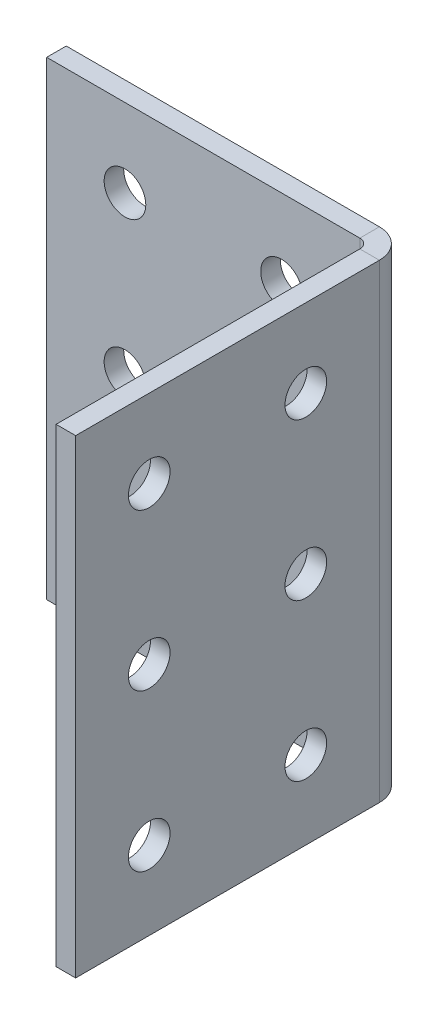
ISO-10303-21;
HEADER;
FILE_DESCRIPTION(('STEP AP214'),'2;1');
FILE_NAME('part.step','',(''),(''),'','','');
FILE_SCHEMA(('AUTOMOTIVE_DESIGN { 1 0 10303 214 1 1 1 1 }'));
ENDSEC;
DATA;
#1=APPLICATION_CONTEXT('core data for automotive mechanical design processes');
#2=APPLICATION_PROTOCOL_DEFINITION('international standard','automotive_design',2000,#1);
#3=PRODUCT_CONTEXT('',#1,'mechanical');
#4=PRODUCT('Part','Part','',(#3));
#5=PRODUCT_RELATED_PRODUCT_CATEGORY('part','',(#4));
#6=PRODUCT_DEFINITION_FORMATION('','',#4);
#7=PRODUCT_DEFINITION_CONTEXT('part definition',#1,'design');
#8=PRODUCT_DEFINITION('design','',#6,#7);
#9=PRODUCT_DEFINITION_SHAPE('','',#8);
#10=(LENGTH_UNIT() NAMED_UNIT(*) SI_UNIT(.MILLI.,.METRE.));
#11=(NAMED_UNIT(*) PLANE_ANGLE_UNIT() SI_UNIT($,.RADIAN.));
#12=(NAMED_UNIT(*) SI_UNIT($,.STERADIAN.) SOLID_ANGLE_UNIT());
#13=UNCERTAINTY_MEASURE_WITH_UNIT(LENGTH_MEASURE(1.E-05),#10,'distance_accuracy_value','');
#14=(GEOMETRIC_REPRESENTATION_CONTEXT(3) GLOBAL_UNCERTAINTY_ASSIGNED_CONTEXT((#13)) GLOBAL_UNIT_ASSIGNED_CONTEXT((#10,
#11,#12)) REPRESENTATION_CONTEXT('',''));
#15=CARTESIAN_POINT('',(0.,0.,0.));
#16=DIRECTION('',(0.,0.,1.));
#17=DIRECTION('',(1.,0.,0.));
#18=AXIS2_PLACEMENT_3D('',#15,#16,#17);
#19=CARTESIAN_POINT('',(0.,0.,0.));
#20=DIRECTION('',(0.,0.,-1.));
#21=DIRECTION('',(-1.,0.,0.));
#22=AXIS2_PLACEMENT_3D('',#19,#20,#21);
#23=PLANE('',#22);
#24=CARTESIAN_POINT('',(38.1,63.5,0.));
#25=DIRECTION('',(0.,0.,1.));
#26=DIRECTION('',(1.,0.,0.));
#27=AXIS2_PLACEMENT_3D('',#24,#25,#26);
#28=CIRCLE('',#27,3.37819999999998);
#29=CARTESIAN_POINT('',(41.4782,63.5,0.));
#30=VERTEX_POINT('',#29);
#31=EDGE_CURVE('E303',#30,#30,#28,.T.);
#32=ORIENTED_EDGE('',*,*,#31,.F.);
#33=EDGE_LOOP('',(#32));
#34=FACE_BOUND('',#33,.T.);
#35=CARTESIAN_POINT('',(12.7,63.5,0.));
#36=DIRECTION('',(0.,0.,1.));
#37=DIRECTION('',(1.,0.,0.));
#38=AXIS2_PLACEMENT_3D('',#35,#36,#37);
#39=CIRCLE('',#38,3.37819999999999);
#40=CARTESIAN_POINT('',(16.0782,63.5,0.));
#41=VERTEX_POINT('',#40);
#42=EDGE_CURVE('E295',#41,#41,#39,.T.);
#43=ORIENTED_EDGE('',*,*,#42,.F.);
#44=EDGE_LOOP('',(#43));
#45=FACE_BOUND('',#44,.T.);
#46=CARTESIAN_POINT('',(12.7,38.1,0.));
#47=DIRECTION('',(0.,0.,1.));
#48=DIRECTION('',(1.,0.,0.));
#49=AXIS2_PLACEMENT_3D('',#46,#47,#48);
#50=CIRCLE('',#49,3.37819999999999);
#51=CARTESIAN_POINT('',(16.0782,38.1,0.));
#52=VERTEX_POINT('',#51);
#53=EDGE_CURVE('E287',#52,#52,#50,.T.);
#54=ORIENTED_EDGE('',*,*,#53,.F.);
#55=EDGE_LOOP('',(#54));
#56=FACE_BOUND('',#55,.T.);
#57=CARTESIAN_POINT('',(38.1,38.1,0.));
#58=DIRECTION('',(0.,0.,1.));
#59=DIRECTION('',(1.,0.,0.));
#60=AXIS2_PLACEMENT_3D('',#57,#58,#59);
#61=CIRCLE('',#60,3.37819999999999);
#62=CARTESIAN_POINT('',(41.4782,38.1,0.));
#63=VERTEX_POINT('',#62);
#64=EDGE_CURVE('E279',#63,#63,#61,.T.);
#65=ORIENTED_EDGE('',*,*,#64,.F.);
#66=EDGE_LOOP('',(#65));
#67=FACE_BOUND('',#66,.T.);
#68=CARTESIAN_POINT('',(12.7,12.7,0.));
#69=DIRECTION('',(0.,0.,1.));
#70=DIRECTION('',(1.,0.,0.));
#71=AXIS2_PLACEMENT_3D('',#68,#69,#70);
#72=CIRCLE('',#71,3.37819999999999);
#73=CARTESIAN_POINT('',(16.0782,12.7,0.));
#74=VERTEX_POINT('',#73);
#75=EDGE_CURVE('E271',#74,#74,#72,.T.);
#76=ORIENTED_EDGE('',*,*,#75,.F.);
#77=EDGE_LOOP('',(#76));
#78=FACE_BOUND('',#77,.T.);
#79=DIRECTION('',(0.,-1.,0.));
#80=VECTOR('',#79,1.);
#81=CARTESIAN_POINT('',(0.,0.,0.));
#82=LINE('',#81,#80);
#83=CARTESIAN_POINT('',(0.,76.2,0.));
#84=VERTEX_POINT('',#83);
#85=CARTESIAN_POINT('',(0.,0.,0.));
#86=VERTEX_POINT('',#85);
#87=EDGE_CURVE('E195',#84,#86,#82,.T.);
#88=ORIENTED_EDGE('',*,*,#87,.T.);
#89=DIRECTION('',(1.,0.,0.));
#90=VECTOR('',#89,1.);
#91=CARTESIAN_POINT('',(0.,0.,0.));
#92=LINE('',#91,#90);
#93=CARTESIAN_POINT('',(50.8,0.,0.));
#94=VERTEX_POINT('',#93);
#95=EDGE_CURVE('E225',#86,#94,#92,.T.);
#96=ORIENTED_EDGE('',*,*,#95,.T.);
#97=DIRECTION('',(0.,1.,0.));
#98=VECTOR('',#97,1.);
#99=CARTESIAN_POINT('',(50.8,0.,0.));
#100=LINE('',#99,#98);
#101=CARTESIAN_POINT('',(50.8,76.2,0.));
#102=VERTEX_POINT('',#101);
#103=EDGE_CURVE('E98',#94,#102,#100,.T.);
#104=ORIENTED_EDGE('',*,*,#103,.T.);
#105=DIRECTION('',(-1.,0.,0.));
#106=VECTOR('',#105,1.);
#107=CARTESIAN_POINT('',(0.,76.2,0.));
#108=LINE('',#107,#106);
#109=EDGE_CURVE('E212',#102,#84,#108,.T.);
#110=ORIENTED_EDGE('',*,*,#109,.T.);
#111=EDGE_LOOP('',(#88,#96,#104,#110));
#112=FACE_BOUND('',#111,.T.);
#113=CARTESIAN_POINT('',(38.1,12.7,0.));
#114=DIRECTION('',(0.,0.,1.));
#115=DIRECTION('',(1.,0.,0.));
#116=AXIS2_PLACEMENT_3D('',#113,#114,#115);
#117=CIRCLE('',#116,3.37819999999999);
#118=CARTESIAN_POINT('',(41.4782,12.7,0.));
#119=VERTEX_POINT('',#118);
#120=EDGE_CURVE('E263',#119,#119,#117,.T.);
#121=ORIENTED_EDGE('',*,*,#120,.F.);
#122=EDGE_LOOP('',(#121));
#123=FACE_BOUND('',#122,.T.);
#124=ADVANCED_FACE('F61',(#34,#45,#56,#67,#78,#112,#123),#23,.F.);
#125=CARTESIAN_POINT('',(0.,0.,-3.175));
#126=DIRECTION('',(-1.,0.,0.));
#127=DIRECTION('',(0.,0.,1.));
#128=AXIS2_PLACEMENT_3D('',#125,#126,#127);
#129=PLANE('',#128);
#130=ORIENTED_EDGE('',*,*,#87,.F.);
#131=DIRECTION('',(0.,0.,1.));
#132=VECTOR('',#131,1.);
#133=CARTESIAN_POINT('',(0.,76.2,-3.175));
#134=LINE('',#133,#132);
#135=CARTESIAN_POINT('',(0.,76.2,-3.175));
#136=VERTEX_POINT('',#135);
#137=EDGE_CURVE('E13',#136,#84,#134,.T.);
#138=ORIENTED_EDGE('',*,*,#137,.F.);
#139=DIRECTION('',(0.,-1.,0.));
#140=VECTOR('',#139,1.);
#141=CARTESIAN_POINT('',(0.,0.,-3.175));
#142=LINE('',#141,#140);
#143=CARTESIAN_POINT('',(0.,0.,-3.175));
#144=VERTEX_POINT('',#143);
#145=EDGE_CURVE('E208',#136,#144,#142,.T.);
#146=ORIENTED_EDGE('',*,*,#145,.T.);
#147=DIRECTION('',(0.,0.,1.));
#148=VECTOR('',#147,1.);
#149=CARTESIAN_POINT('',(0.,0.,-3.175));
#150=LINE('',#149,#148);
#151=EDGE_CURVE('E65',#144,#86,#150,.T.);
#152=ORIENTED_EDGE('',*,*,#151,.T.);
#153=EDGE_LOOP('',(#130,#138,#146,#152));
#154=FACE_BOUND('',#153,.T.);
#155=ADVANCED_FACE('F63',(#154),#129,.T.);
#156=CARTESIAN_POINT('',(0.,76.2,-3.175));
#157=DIRECTION('',(0.,1.,0.));
#158=DIRECTION('',(0.,0.,1.));
#159=AXIS2_PLACEMENT_3D('',#156,#157,#158);
#160=PLANE('',#159);
#161=ORIENTED_EDGE('',*,*,#109,.F.);
#162=DIRECTION('',(0.,0.,1.));
#163=VECTOR('',#162,1.);
#164=CARTESIAN_POINT('',(50.8,76.2,-3.175));
#165=LINE('',#164,#163);
#166=CARTESIAN_POINT('',(50.8,76.2,-3.17500000000001));
#167=VERTEX_POINT('',#166);
#168=EDGE_CURVE('E72',#167,#102,#165,.T.);
#169=ORIENTED_EDGE('',*,*,#168,.F.);
#170=DIRECTION('',(-1.,0.,0.));
#171=VECTOR('',#170,1.);
#172=CARTESIAN_POINT('',(0.,76.2,-3.175));
#173=LINE('',#172,#171);
#174=EDGE_CURVE('E219',#167,#136,#173,.T.);
#175=ORIENTED_EDGE('',*,*,#174,.T.);
#176=ORIENTED_EDGE('',*,*,#137,.T.);
#177=EDGE_LOOP('',(#161,#169,#175,#176));
#178=FACE_BOUND('',#177,.T.);
#179=ADVANCED_FACE('F243',(#178),#160,.T.);
#180=CARTESIAN_POINT('',(0.,0.,-3.175));
#181=DIRECTION('',(0.,-1.,0.));
#182=DIRECTION('',(0.,0.,-1.));
#183=AXIS2_PLACEMENT_3D('',#180,#181,#182);
#184=PLANE('',#183);
#185=ORIENTED_EDGE('',*,*,#95,.F.);
#186=ORIENTED_EDGE('',*,*,#151,.F.);
#187=DIRECTION('',(1.,0.,0.));
#188=VECTOR('',#187,1.);
#189=CARTESIAN_POINT('',(0.,0.,-3.175));
#190=LINE('',#189,#188);
#191=CARTESIAN_POINT('',(50.8,0.,-3.175));
#192=VERTEX_POINT('',#191);
#193=EDGE_CURVE('E211',#144,#192,#190,.T.);
#194=ORIENTED_EDGE('',*,*,#193,.T.);
#195=DIRECTION('',(0.,0.,1.));
#196=VECTOR('',#195,1.);
#197=CARTESIAN_POINT('',(50.8,0.,-3.175));
#198=LINE('',#197,#196);
#199=EDGE_CURVE('E234',#192,#94,#198,.T.);
#200=ORIENTED_EDGE('',*,*,#199,.T.);
#201=EDGE_LOOP('',(#185,#186,#194,#200));
#202=FACE_BOUND('',#201,.T.);
#203=ADVANCED_FACE('F240',(#202),#184,.T.);
#204=CARTESIAN_POINT('',(0.,0.,-3.175));
#205=DIRECTION('',(0.,0.,-1.));
#206=DIRECTION('',(-1.,0.,0.));
#207=AXIS2_PLACEMENT_3D('',#204,#205,#206);
#208=PLANE('',#207);
#209=CARTESIAN_POINT('',(38.1,63.5,-3.175));
#210=DIRECTION('',(0.,0.,-1.));
#211=DIRECTION('',(-1.,0.,0.));
#212=AXIS2_PLACEMENT_3D('',#209,#210,#211);
#213=CIRCLE('',#212,3.37819999999999);
#214=CARTESIAN_POINT('',(34.7218,63.5,-3.175));
#215=VERTEX_POINT('',#214);
#216=EDGE_CURVE('E299',#215,#215,#213,.T.);
#217=ORIENTED_EDGE('',*,*,#216,.F.);
#218=EDGE_LOOP('',(#217));
#219=FACE_BOUND('',#218,.T.);
#220=CARTESIAN_POINT('',(12.7,63.5,-3.175));
#221=DIRECTION('',(0.,0.,-1.));
#222=DIRECTION('',(-1.,0.,0.));
#223=AXIS2_PLACEMENT_3D('',#220,#221,#222);
#224=CIRCLE('',#223,3.37819999999999);
#225=CARTESIAN_POINT('',(9.3218,63.5,-3.175));
#226=VERTEX_POINT('',#225);
#227=EDGE_CURVE('E291',#226,#226,#224,.T.);
#228=ORIENTED_EDGE('',*,*,#227,.F.);
#229=EDGE_LOOP('',(#228));
#230=FACE_BOUND('',#229,.T.);
#231=CARTESIAN_POINT('',(12.7,38.1,-3.175));
#232=DIRECTION('',(0.,0.,-1.));
#233=DIRECTION('',(-1.,0.,0.));
#234=AXIS2_PLACEMENT_3D('',#231,#232,#233);
#235=CIRCLE('',#234,3.37819999999999);
#236=CARTESIAN_POINT('',(9.3218,38.1,-3.175));
#237=VERTEX_POINT('',#236);
#238=EDGE_CURVE('E283',#237,#237,#235,.T.);
#239=ORIENTED_EDGE('',*,*,#238,.F.);
#240=EDGE_LOOP('',(#239));
#241=FACE_BOUND('',#240,.T.);
#242=CARTESIAN_POINT('',(38.1,38.1,-3.175));
#243=DIRECTION('',(0.,0.,-1.));
#244=DIRECTION('',(-1.,0.,0.));
#245=AXIS2_PLACEMENT_3D('',#242,#243,#244);
#246=CIRCLE('',#245,3.37819999999999);
#247=CARTESIAN_POINT('',(34.7218,38.1,-3.175));
#248=VERTEX_POINT('',#247);
#249=EDGE_CURVE('E275',#248,#248,#246,.T.);
#250=ORIENTED_EDGE('',*,*,#249,.F.);
#251=EDGE_LOOP('',(#250));
#252=FACE_BOUND('',#251,.T.);
#253=CARTESIAN_POINT('',(12.7,12.7,-3.175));
#254=DIRECTION('',(0.,0.,-1.));
#255=DIRECTION('',(-1.,0.,0.));
#256=AXIS2_PLACEMENT_3D('',#253,#254,#255);
#257=CIRCLE('',#256,3.37819999999999);
#258=CARTESIAN_POINT('',(9.3218,12.7,-3.175));
#259=VERTEX_POINT('',#258);
#260=EDGE_CURVE('E267',#259,#259,#257,.T.);
#261=ORIENTED_EDGE('',*,*,#260,.F.);
#262=EDGE_LOOP('',(#261));
#263=FACE_BOUND('',#262,.T.);
#264=CARTESIAN_POINT('',(38.1,12.7,-3.175));
#265=DIRECTION('',(0.,0.,-1.));
#266=DIRECTION('',(-1.,0.,0.));
#267=AXIS2_PLACEMENT_3D('',#264,#265,#266);
#268=CIRCLE('',#267,3.37819999999999);
#269=CARTESIAN_POINT('',(34.7218,12.7,-3.175));
#270=VERTEX_POINT('',#269);
#271=EDGE_CURVE('E190',#270,#270,#268,.T.);
#272=ORIENTED_EDGE('',*,*,#271,.F.);
#273=EDGE_LOOP('',(#272));
#274=FACE_BOUND('',#273,.T.);
#275=ORIENTED_EDGE('',*,*,#145,.F.);
#276=ORIENTED_EDGE('',*,*,#174,.F.);
#277=DIRECTION('',(0.,1.,0.));
#278=VECTOR('',#277,1.);
#279=CARTESIAN_POINT('',(50.8,0.,-3.175));
#280=LINE('',#279,#278);
#281=EDGE_CURVE('E215',#192,#167,#280,.T.);
#282=ORIENTED_EDGE('',*,*,#281,.F.);
#283=ORIENTED_EDGE('',*,*,#193,.F.);
#284=EDGE_LOOP('',(#275,#276,#282,#283));
#285=FACE_BOUND('',#284,.T.);
#286=ADVANCED_FACE('F399',(#219,#230,#241,#252,#263,#274,#285),#208,.T.);
#287=CARTESIAN_POINT('',(50.8,0.,1.524));
#288=DIRECTION('',(0.,-1.,0.));
#289=DIRECTION('',(0.,0.,-1.));
#290=AXIS2_PLACEMENT_3D('',#287,#288,#289);
#291=PLANE('',#290);
#292=DIRECTION('',(-1.,0.,0.));
#293=VECTOR('',#292,1.);
#294=CARTESIAN_POINT('',(55.499,0.,1.52399999999999));
#295=LINE('',#294,#293);
#296=CARTESIAN_POINT('',(52.324,0.,1.524));
#297=VERTEX_POINT('',#296);
#298=CARTESIAN_POINT('',(55.499,0.,1.52399999999999));
#299=VERTEX_POINT('',#298);
#300=EDGE_CURVE('E162',#297,#299,#295,.F.);
#301=ORIENTED_EDGE('',*,*,#300,.F.);
#302=CARTESIAN_POINT('',(50.8,0.,1.524));
#303=DIRECTION('',(0.,1.,0.));
#304=DIRECTION('',(0.,0.,1.));
#305=AXIS2_PLACEMENT_3D('',#302,#303,#304);
#306=CIRCLE('',#305,1.52400000000001);
#307=EDGE_CURVE('E200',#94,#297,#306,.F.);
#308=ORIENTED_EDGE('',*,*,#307,.F.);
#309=ORIENTED_EDGE('',*,*,#199,.F.);
#310=CARTESIAN_POINT('',(50.8,0.,1.524));
#311=DIRECTION('',(0.,1.,0.));
#312=DIRECTION('',(0.,0.,1.));
#313=AXIS2_PLACEMENT_3D('',#310,#311,#312);
#314=CIRCLE('',#313,4.69900000000001);
#315=EDGE_CURVE('E191',#192,#299,#314,.F.);
#316=ORIENTED_EDGE('',*,*,#315,.T.);
#317=EDGE_LOOP('',(#301,#308,#309,#316));
#318=FACE_BOUND('',#317,.T.);
#319=ADVANCED_FACE('F406',(#318),#291,.T.);
#320=CARTESIAN_POINT('',(50.8,76.2,1.524));
#321=DIRECTION('',(0.,-1.,0.));
#322=DIRECTION('',(0.,0.,-1.));
#323=AXIS2_PLACEMENT_3D('',#320,#321,#322);
#324=PLANE('',#323);
#325=CARTESIAN_POINT('',(50.8,76.2,1.524));
#326=DIRECTION('',(0.,1.,0.));
#327=DIRECTION('',(0.,0.,1.));
#328=AXIS2_PLACEMENT_3D('',#325,#326,#327);
#329=CIRCLE('',#328,1.52400000000001);
#330=CARTESIAN_POINT('',(52.324,76.2,1.524));
#331=VERTEX_POINT('',#330);
#332=EDGE_CURVE('E204',#331,#102,#329,.T.);
#333=ORIENTED_EDGE('',*,*,#332,.F.);
#334=DIRECTION('',(-1.,0.,0.));
#335=VECTOR('',#334,1.);
#336=CARTESIAN_POINT('',(52.324,76.2,1.524));
#337=LINE('',#336,#335);
#338=CARTESIAN_POINT('',(55.499,76.2,1.52399999999999));
#339=VERTEX_POINT('',#338);
#340=EDGE_CURVE('E181',#331,#339,#337,.F.);
#341=ORIENTED_EDGE('',*,*,#340,.T.);
#342=CARTESIAN_POINT('',(50.8,76.2,1.524));
#343=DIRECTION('',(0.,1.,0.));
#344=DIRECTION('',(0.,0.,1.));
#345=AXIS2_PLACEMENT_3D('',#342,#343,#344);
#346=CIRCLE('',#345,4.69900000000001);
#347=EDGE_CURVE('E196',#339,#167,#346,.T.);
#348=ORIENTED_EDGE('',*,*,#347,.T.);
#349=ORIENTED_EDGE('',*,*,#168,.T.);
#350=EDGE_LOOP('',(#333,#341,#348,#349));
#351=FACE_BOUND('',#350,.T.);
#352=ADVANCED_FACE('F246',(#351),#324,.F.);
#353=CARTESIAN_POINT('',(50.8,76.2,1.524));
#354=DIRECTION('',(0.,1.,0.));
#355=DIRECTION('',(1.,0.,0.));
#356=AXIS2_PLACEMENT_3D('',#353,#354,#355);
#357=CYLINDRICAL_SURFACE('',#356,4.69900000000001);
#358=ORIENTED_EDGE('',*,*,#281,.T.);
#359=ORIENTED_EDGE('',*,*,#347,.F.);
#360=DIRECTION('',(0.,1.,0.));
#361=VECTOR('',#360,1.);
#362=CARTESIAN_POINT('',(55.499,0.,1.52399999999999));
#363=LINE('',#362,#361);
#364=EDGE_CURVE('E178',#339,#299,#363,.F.);
#365=ORIENTED_EDGE('',*,*,#364,.T.);
#366=ORIENTED_EDGE('',*,*,#315,.F.);
#367=EDGE_LOOP('',(#358,#359,#365,#366));
#368=FACE_BOUND('',#367,.T.);
#369=ADVANCED_FACE('F427',(#368),#357,.T.);
#370=CARTESIAN_POINT('',(50.8,76.2,1.524));
#371=DIRECTION('',(0.,1.,0.));
#372=DIRECTION('',(1.,0.,0.));
#373=AXIS2_PLACEMENT_3D('',#370,#371,#372);
#374=CYLINDRICAL_SURFACE('',#373,1.52400000000001);
#375=ORIENTED_EDGE('',*,*,#103,.F.);
#376=ORIENTED_EDGE('',*,*,#307,.T.);
#377=DIRECTION('',(0.,1.,0.));
#378=VECTOR('',#377,1.);
#379=CARTESIAN_POINT('',(52.324,0.,1.524));
#380=LINE('',#379,#378);
#381=EDGE_CURVE('E185',#297,#331,#380,.T.);
#382=ORIENTED_EDGE('',*,*,#381,.T.);
#383=ORIENTED_EDGE('',*,*,#332,.T.);
#384=EDGE_LOOP('',(#375,#376,#382,#383));
#385=FACE_BOUND('',#384,.T.);
#386=ADVANCED_FACE('F249',(#385),#374,.F.);
#387=CARTESIAN_POINT('',(55.4990000000002,76.2,50.8));
#388=DIRECTION('',(0.,-1.,0.));
#389=DIRECTION('',(1.,0.,0.));
#390=AXIS2_PLACEMENT_3D('',#387,#388,#389);
#391=PLANE('',#390);
#392=ORIENTED_EDGE('',*,*,#340,.F.);
#393=DIRECTION('',(0.,0.,-1.));
#394=VECTOR('',#393,1.);
#395=CARTESIAN_POINT('',(52.3240000000002,76.2,50.8));
#396=LINE('',#395,#394);
#397=CARTESIAN_POINT('',(52.3240000000002,76.2,50.8));
#398=VERTEX_POINT('',#397);
#399=EDGE_CURVE('E175',#331,#398,#396,.F.);
#400=ORIENTED_EDGE('',*,*,#399,.T.);
#401=DIRECTION('',(-1.,0.,0.));
#402=VECTOR('',#401,1.);
#403=CARTESIAN_POINT('',(55.4990000000002,76.2,50.8));
#404=LINE('',#403,#402);
#405=CARTESIAN_POINT('',(55.4990000000002,76.2,50.8));
#406=VERTEX_POINT('',#405);
#407=EDGE_CURVE('E158',#406,#398,#404,.T.);
#408=ORIENTED_EDGE('',*,*,#407,.F.);
#409=DIRECTION('',(0.,0.,1.));
#410=VECTOR('',#409,1.);
#411=CARTESIAN_POINT('',(55.499,76.2,-1.91496694752415E-13));
#412=LINE('',#411,#410);
#413=EDGE_CURVE('E143',#339,#406,#412,.T.);
#414=ORIENTED_EDGE('',*,*,#413,.F.);
#415=EDGE_LOOP('',(#392,#400,#408,#414));
#416=FACE_BOUND('',#415,.T.);
#417=ADVANCED_FACE('F256',(#416),#391,.F.);
#418=CARTESIAN_POINT('',(55.499,0.,0.));
#419=DIRECTION('',(0.,1.,0.));
#420=DIRECTION('',(-1.,0.,0.));
#421=AXIS2_PLACEMENT_3D('',#418,#419,#420);
#422=PLANE('',#421);
#423=ORIENTED_EDGE('',*,*,#300,.T.);
#424=DIRECTION('',(0.,0.,-1.));
#425=VECTOR('',#424,1.);
#426=CARTESIAN_POINT('',(55.499,0.,-1.91496694752415E-13));
#427=LINE('',#426,#425);
#428=CARTESIAN_POINT('',(55.4990000000002,0.,50.8));
#429=VERTEX_POINT('',#428);
#430=EDGE_CURVE('E141',#429,#299,#427,.T.);
#431=ORIENTED_EDGE('',*,*,#430,.F.);
#432=DIRECTION('',(-1.,0.,0.));
#433=VECTOR('',#432,1.);
#434=CARTESIAN_POINT('',(55.4990000000002,0.,50.8));
#435=LINE('',#434,#433);
#436=CARTESIAN_POINT('',(52.3240000000002,0.,50.8));
#437=VERTEX_POINT('',#436);
#438=EDGE_CURVE('E150',#429,#437,#435,.T.);
#439=ORIENTED_EDGE('',*,*,#438,.T.);
#440=DIRECTION('',(0.,0.,1.));
#441=VECTOR('',#440,1.);
#442=CARTESIAN_POINT('',(52.324,0.,0.));
#443=LINE('',#442,#441);
#444=EDGE_CURVE('E170',#437,#297,#443,.F.);
#445=ORIENTED_EDGE('',*,*,#444,.T.);
#446=EDGE_LOOP('',(#423,#431,#439,#445));
#447=FACE_BOUND('',#446,.T.);
#448=ADVANCED_FACE('F161',(#447),#422,.F.);
#449=CARTESIAN_POINT('',(55.499,0.,-1.91496694752415E-13));
#450=DIRECTION('',(-1.,0.,0.));
#451=DIRECTION('',(0.,0.,1.));
#452=AXIS2_PLACEMENT_3D('',#449,#450,#451);
#453=PLANE('',#452);
#454=CARTESIAN_POINT('',(55.499,63.5,13.462));
#455=DIRECTION('',(-1.,0.,0.));
#456=DIRECTION('',(0.,0.,1.));
#457=AXIS2_PLACEMENT_3D('',#454,#455,#456);
#458=CIRCLE('',#457,3.37819999999999);
#459=CARTESIAN_POINT('',(55.4990000000001,63.5,16.8402));
#460=VERTEX_POINT('',#459);
#461=EDGE_CURVE('E347',#460,#460,#458,.T.);
#462=ORIENTED_EDGE('',*,*,#461,.T.);
#463=EDGE_LOOP('',(#462));
#464=FACE_BOUND('',#463,.T.);
#465=CARTESIAN_POINT('',(55.4990000000001,63.5,38.862));
#466=DIRECTION('',(-1.,0.,0.));
#467=DIRECTION('',(0.,0.,1.));
#468=AXIS2_PLACEMENT_3D('',#465,#466,#467);
#469=CIRCLE('',#468,3.37819999999999);
#470=CARTESIAN_POINT('',(55.4990000000001,63.5,42.2402));
#471=VERTEX_POINT('',#470);
#472=EDGE_CURVE('E339',#471,#471,#469,.T.);
#473=ORIENTED_EDGE('',*,*,#472,.T.);
#474=EDGE_LOOP('',(#473));
#475=FACE_BOUND('',#474,.T.);
#476=CARTESIAN_POINT('',(55.499,38.1,13.462));
#477=DIRECTION('',(-1.,0.,0.));
#478=DIRECTION('',(0.,0.,1.));
#479=AXIS2_PLACEMENT_3D('',#476,#477,#478);
#480=CIRCLE('',#479,3.37819999999999);
#481=CARTESIAN_POINT('',(55.4990000000001,38.1,16.8402));
#482=VERTEX_POINT('',#481);
#483=EDGE_CURVE('E331',#482,#482,#480,.T.);
#484=ORIENTED_EDGE('',*,*,#483,.T.);
#485=EDGE_LOOP('',(#484));
#486=FACE_BOUND('',#485,.T.);
#487=CARTESIAN_POINT('',(55.4990000000001,38.1,38.862));
#488=DIRECTION('',(-1.,0.,0.));
#489=DIRECTION('',(0.,0.,1.));
#490=AXIS2_PLACEMENT_3D('',#487,#488,#489);
#491=CIRCLE('',#490,3.37819999999999);
#492=CARTESIAN_POINT('',(55.4990000000002,38.1,42.2402));
#493=VERTEX_POINT('',#492);
#494=EDGE_CURVE('E323',#493,#493,#491,.T.);
#495=ORIENTED_EDGE('',*,*,#494,.T.);
#496=EDGE_LOOP('',(#495));
#497=FACE_BOUND('',#496,.T.);
#498=CARTESIAN_POINT('',(55.4990000000001,12.7,13.462));
#499=DIRECTION('',(-1.,0.,0.));
#500=DIRECTION('',(0.,0.,1.));
#501=AXIS2_PLACEMENT_3D('',#498,#499,#500);
#502=CIRCLE('',#501,3.37819999999999);
#503=CARTESIAN_POINT('',(55.4990000000001,12.7,16.8402));
#504=VERTEX_POINT('',#503);
#505=EDGE_CURVE('E315',#504,#504,#502,.T.);
#506=ORIENTED_EDGE('',*,*,#505,.T.);
#507=EDGE_LOOP('',(#506));
#508=FACE_BOUND('',#507,.T.);
#509=CARTESIAN_POINT('',(55.4990000000001,12.7,38.862));
#510=DIRECTION('',(-1.,0.,0.));
#511=DIRECTION('',(0.,0.,1.));
#512=AXIS2_PLACEMENT_3D('',#509,#510,#511);
#513=CIRCLE('',#512,3.37819999999999);
#514=CARTESIAN_POINT('',(55.4990000000002,12.7,42.2402));
#515=VERTEX_POINT('',#514);
#516=EDGE_CURVE('E307',#515,#515,#513,.T.);
#517=ORIENTED_EDGE('',*,*,#516,.T.);
#518=EDGE_LOOP('',(#517));
#519=FACE_BOUND('',#518,.T.);
#520=ORIENTED_EDGE('',*,*,#364,.F.);
#521=ORIENTED_EDGE('',*,*,#413,.T.);
#522=DIRECTION('',(0.,-1.,0.));
#523=VECTOR('',#522,1.);
#524=CARTESIAN_POINT('',(55.4990000000002,0.,50.8));
#525=LINE('',#524,#523);
#526=EDGE_CURVE('E136',#406,#429,#525,.T.);
#527=ORIENTED_EDGE('',*,*,#526,.T.);
#528=ORIENTED_EDGE('',*,*,#430,.T.);
#529=EDGE_LOOP('',(#520,#521,#527,#528));
#530=FACE_BOUND('',#529,.T.);
#531=ADVANCED_FACE('F139',(#464,#475,#486,#497,#508,#519,#530),#453,.F.);
#532=CARTESIAN_POINT('',(52.324,0.,-1.80411241501588E-13));
#533=DIRECTION('',(-1.,0.,0.));
#534=DIRECTION('',(0.,0.,1.));
#535=AXIS2_PLACEMENT_3D('',#532,#533,#534);
#536=PLANE('',#535);
#537=CARTESIAN_POINT('',(52.324,63.5,13.462));
#538=DIRECTION('',(-1.,0.,0.));
#539=DIRECTION('',(0.,0.,1.));
#540=AXIS2_PLACEMENT_3D('',#537,#538,#539);
#541=CIRCLE('',#540,3.37819999999998);
#542=CARTESIAN_POINT('',(52.324,63.5,16.8402));
#543=VERTEX_POINT('',#542);
#544=EDGE_CURVE('E351',#543,#543,#541,.T.);
#545=ORIENTED_EDGE('',*,*,#544,.F.);
#546=EDGE_LOOP('',(#545));
#547=FACE_BOUND('',#546,.T.);
#548=CARTESIAN_POINT('',(52.3240000000001,63.5,38.862));
#549=DIRECTION('',(-1.,0.,0.));
#550=DIRECTION('',(0.,0.,1.));
#551=AXIS2_PLACEMENT_3D('',#548,#549,#550);
#552=CIRCLE('',#551,3.37819999999998);
#553=CARTESIAN_POINT('',(52.3240000000001,63.5,42.2402));
#554=VERTEX_POINT('',#553);
#555=EDGE_CURVE('E343',#554,#554,#552,.T.);
#556=ORIENTED_EDGE('',*,*,#555,.F.);
#557=EDGE_LOOP('',(#556));
#558=FACE_BOUND('',#557,.T.);
#559=CARTESIAN_POINT('',(52.324,38.1,13.462));
#560=DIRECTION('',(-1.,0.,0.));
#561=DIRECTION('',(0.,0.,1.));
#562=AXIS2_PLACEMENT_3D('',#559,#560,#561);
#563=CIRCLE('',#562,3.37819999999999);
#564=CARTESIAN_POINT('',(52.3240000000001,38.1,16.8402));
#565=VERTEX_POINT('',#564);
#566=EDGE_CURVE('E335',#565,#565,#563,.T.);
#567=ORIENTED_EDGE('',*,*,#566,.F.);
#568=EDGE_LOOP('',(#567));
#569=FACE_BOUND('',#568,.T.);
#570=CARTESIAN_POINT('',(52.3240000000001,38.1,38.862));
#571=DIRECTION('',(-1.,0.,0.));
#572=DIRECTION('',(0.,0.,1.));
#573=AXIS2_PLACEMENT_3D('',#570,#571,#572);
#574=CIRCLE('',#573,3.37819999999999);
#575=CARTESIAN_POINT('',(52.3240000000001,38.1,42.2402));
#576=VERTEX_POINT('',#575);
#577=EDGE_CURVE('E327',#576,#576,#574,.T.);
#578=ORIENTED_EDGE('',*,*,#577,.F.);
#579=EDGE_LOOP('',(#578));
#580=FACE_BOUND('',#579,.T.);
#581=CARTESIAN_POINT('',(52.324,12.7,13.462));
#582=DIRECTION('',(-1.,0.,0.));
#583=DIRECTION('',(0.,0.,1.));
#584=AXIS2_PLACEMENT_3D('',#581,#582,#583);
#585=CIRCLE('',#584,3.37819999999999);
#586=CARTESIAN_POINT('',(52.3240000000001,12.7,16.8402));
#587=VERTEX_POINT('',#586);
#588=EDGE_CURVE('E319',#587,#587,#585,.T.);
#589=ORIENTED_EDGE('',*,*,#588,.F.);
#590=EDGE_LOOP('',(#589));
#591=FACE_BOUND('',#590,.T.);
#592=CARTESIAN_POINT('',(52.3240000000001,12.7,38.862));
#593=DIRECTION('',(-1.,0.,0.));
#594=DIRECTION('',(0.,0.,1.));
#595=AXIS2_PLACEMENT_3D('',#592,#593,#594);
#596=CIRCLE('',#595,3.37819999999999);
#597=CARTESIAN_POINT('',(52.3240000000002,12.7,42.2402));
#598=VERTEX_POINT('',#597);
#599=EDGE_CURVE('E311',#598,#598,#596,.T.);
#600=ORIENTED_EDGE('',*,*,#599,.F.);
#601=EDGE_LOOP('',(#600));
#602=FACE_BOUND('',#601,.T.);
#603=ORIENTED_EDGE('',*,*,#399,.F.);
#604=ORIENTED_EDGE('',*,*,#381,.F.);
#605=ORIENTED_EDGE('',*,*,#444,.F.);
#606=DIRECTION('',(0.,1.,0.));
#607=VECTOR('',#606,1.);
#608=CARTESIAN_POINT('',(52.3240000000002,0.,50.8));
#609=LINE('',#608,#607);
#610=EDGE_CURVE('E153',#398,#437,#609,.F.);
#611=ORIENTED_EDGE('',*,*,#610,.F.);
#612=EDGE_LOOP('',(#603,#604,#605,#611));
#613=FACE_BOUND('',#612,.T.);
#614=ADVANCED_FACE('F254',(#547,#558,#569,#580,#591,#602,#613),#536,.T.);
#615=CARTESIAN_POINT('',(55.4990000000002,0.,50.8));
#616=DIRECTION('',(0.,0.,-1.));
#617=DIRECTION('',(-1.,0.,0.));
#618=AXIS2_PLACEMENT_3D('',#615,#616,#617);
#619=PLANE('',#618);
#620=ORIENTED_EDGE('',*,*,#610,.T.);
#621=ORIENTED_EDGE('',*,*,#438,.F.);
#622=ORIENTED_EDGE('',*,*,#526,.F.);
#623=ORIENTED_EDGE('',*,*,#407,.T.);
#624=EDGE_LOOP('',(#620,#621,#622,#623));
#625=FACE_BOUND('',#624,.T.);
#626=ADVANCED_FACE('F151',(#625),#619,.F.);
#627=CARTESIAN_POINT('',(38.1,12.7,0.));
#628=DIRECTION('',(0.,0.,1.));
#629=DIRECTION('',(1.,0.,0.));
#630=AXIS2_PLACEMENT_3D('',#627,#628,#629);
#631=CYLINDRICAL_SURFACE('',#630,3.37819999999999);
#632=ORIENTED_EDGE('',*,*,#120,.T.);
#633=EDGE_LOOP('',(#632));
#634=FACE_BOUND('',#633,.T.);
#635=ORIENTED_EDGE('',*,*,#271,.T.);
#636=EDGE_LOOP('',(#635));
#637=FACE_BOUND('',#636,.T.);
#638=ADVANCED_FACE('F440',(#634,#637),#631,.F.);
#639=CARTESIAN_POINT('',(12.7,12.7,0.));
#640=DIRECTION('',(0.,0.,1.));
#641=DIRECTION('',(1.,0.,0.));
#642=AXIS2_PLACEMENT_3D('',#639,#640,#641);
#643=CYLINDRICAL_SURFACE('',#642,3.37819999999999);
#644=ORIENTED_EDGE('',*,*,#75,.T.);
#645=EDGE_LOOP('',(#644));
#646=FACE_BOUND('',#645,.T.);
#647=ORIENTED_EDGE('',*,*,#260,.T.);
#648=EDGE_LOOP('',(#647));
#649=FACE_BOUND('',#648,.T.);
#650=ADVANCED_FACE('F448',(#646,#649),#643,.F.);
#651=CARTESIAN_POINT('',(38.1,38.1,0.));
#652=DIRECTION('',(0.,0.,1.));
#653=DIRECTION('',(1.,0.,0.));
#654=AXIS2_PLACEMENT_3D('',#651,#652,#653);
#655=CYLINDRICAL_SURFACE('',#654,3.37819999999999);
#656=ORIENTED_EDGE('',*,*,#64,.T.);
#657=EDGE_LOOP('',(#656));
#658=FACE_BOUND('',#657,.T.);
#659=ORIENTED_EDGE('',*,*,#249,.T.);
#660=EDGE_LOOP('',(#659));
#661=FACE_BOUND('',#660,.T.);
#662=ADVANCED_FACE('F452',(#658,#661),#655,.F.);
#663=CARTESIAN_POINT('',(12.7,38.1,0.));
#664=DIRECTION('',(0.,0.,1.));
#665=DIRECTION('',(1.,0.,0.));
#666=AXIS2_PLACEMENT_3D('',#663,#664,#665);
#667=CYLINDRICAL_SURFACE('',#666,3.37819999999999);
#668=ORIENTED_EDGE('',*,*,#53,.T.);
#669=EDGE_LOOP('',(#668));
#670=FACE_BOUND('',#669,.T.);
#671=ORIENTED_EDGE('',*,*,#238,.T.);
#672=EDGE_LOOP('',(#671));
#673=FACE_BOUND('',#672,.T.);
#674=ADVANCED_FACE('F456',(#670,#673),#667,.F.);
#675=CARTESIAN_POINT('',(12.7,63.5,0.));
#676=DIRECTION('',(0.,0.,1.));
#677=DIRECTION('',(1.,0.,0.));
#678=AXIS2_PLACEMENT_3D('',#675,#676,#677);
#679=CYLINDRICAL_SURFACE('',#678,3.37819999999999);
#680=ORIENTED_EDGE('',*,*,#42,.T.);
#681=EDGE_LOOP('',(#680));
#682=FACE_BOUND('',#681,.T.);
#683=ORIENTED_EDGE('',*,*,#227,.T.);
#684=EDGE_LOOP('',(#683));
#685=FACE_BOUND('',#684,.T.);
#686=ADVANCED_FACE('F385',(#682,#685),#679,.F.);
#687=CARTESIAN_POINT('',(38.1,63.5,0.));
#688=DIRECTION('',(0.,0.,1.));
#689=DIRECTION('',(1.,0.,0.));
#690=AXIS2_PLACEMENT_3D('',#687,#688,#689);
#691=CYLINDRICAL_SURFACE('',#690,3.37819999999999);
#692=ORIENTED_EDGE('',*,*,#31,.T.);
#693=EDGE_LOOP('',(#692));
#694=FACE_BOUND('',#693,.T.);
#695=ORIENTED_EDGE('',*,*,#216,.T.);
#696=EDGE_LOOP('',(#695));
#697=FACE_BOUND('',#696,.T.);
#698=ADVANCED_FACE('F375',(#694,#697),#691,.F.);
#699=CARTESIAN_POINT('',(52.3240000000001,12.7,38.862));
#700=DIRECTION('',(-1.,0.,0.));
#701=DIRECTION('',(0.,0.,1.));
#702=AXIS2_PLACEMENT_3D('',#699,#700,#701);
#703=CYLINDRICAL_SURFACE('',#702,3.37819999999999);
#704=ORIENTED_EDGE('',*,*,#516,.F.);
#705=EDGE_LOOP('',(#704));
#706=FACE_BOUND('',#705,.T.);
#707=ORIENTED_EDGE('',*,*,#599,.T.);
#708=EDGE_LOOP('',(#707));
#709=FACE_BOUND('',#708,.T.);
#710=ADVANCED_FACE('F372',(#706,#709),#703,.F.);
#711=CARTESIAN_POINT('',(52.324,12.7,13.462));
#712=DIRECTION('',(-1.,0.,0.));
#713=DIRECTION('',(0.,0.,1.));
#714=AXIS2_PLACEMENT_3D('',#711,#712,#713);
#715=CYLINDRICAL_SURFACE('',#714,3.37819999999999);
#716=ORIENTED_EDGE('',*,*,#505,.F.);
#717=EDGE_LOOP('',(#716));
#718=FACE_BOUND('',#717,.T.);
#719=ORIENTED_EDGE('',*,*,#588,.T.);
#720=EDGE_LOOP('',(#719));
#721=FACE_BOUND('',#720,.T.);
#722=ADVANCED_FACE('F374',(#718,#721),#715,.F.);
#723=CARTESIAN_POINT('',(52.3240000000001,38.1,38.862));
#724=DIRECTION('',(-1.,0.,0.));
#725=DIRECTION('',(0.,0.,1.));
#726=AXIS2_PLACEMENT_3D('',#723,#724,#725);
#727=CYLINDRICAL_SURFACE('',#726,3.37819999999999);
#728=ORIENTED_EDGE('',*,*,#494,.F.);
#729=EDGE_LOOP('',(#728));
#730=FACE_BOUND('',#729,.T.);
#731=ORIENTED_EDGE('',*,*,#577,.T.);
#732=EDGE_LOOP('',(#731));
#733=FACE_BOUND('',#732,.T.);
#734=ADVANCED_FACE('F382',(#730,#733),#727,.F.);
#735=CARTESIAN_POINT('',(52.324,38.1,13.462));
#736=DIRECTION('',(-1.,0.,0.));
#737=DIRECTION('',(0.,0.,1.));
#738=AXIS2_PLACEMENT_3D('',#735,#736,#737);
#739=CYLINDRICAL_SURFACE('',#738,3.37819999999999);
#740=ORIENTED_EDGE('',*,*,#483,.F.);
#741=EDGE_LOOP('',(#740));
#742=FACE_BOUND('',#741,.T.);
#743=ORIENTED_EDGE('',*,*,#566,.T.);
#744=EDGE_LOOP('',(#743));
#745=FACE_BOUND('',#744,.T.);
#746=ADVANCED_FACE('F520',(#742,#745),#739,.F.);
#747=CARTESIAN_POINT('',(52.3240000000001,63.5,38.862));
#748=DIRECTION('',(-1.,0.,0.));
#749=DIRECTION('',(0.,0.,1.));
#750=AXIS2_PLACEMENT_3D('',#747,#748,#749);
#751=CYLINDRICAL_SURFACE('',#750,3.37819999999999);
#752=ORIENTED_EDGE('',*,*,#472,.F.);
#753=EDGE_LOOP('',(#752));
#754=FACE_BOUND('',#753,.T.);
#755=ORIENTED_EDGE('',*,*,#555,.T.);
#756=EDGE_LOOP('',(#755));
#757=FACE_BOUND('',#756,.T.);
#758=ADVANCED_FACE('F531',(#754,#757),#751,.F.);
#759=CARTESIAN_POINT('',(52.324,63.5,13.462));
#760=DIRECTION('',(-1.,0.,0.));
#761=DIRECTION('',(0.,0.,1.));
#762=AXIS2_PLACEMENT_3D('',#759,#760,#761);
#763=CYLINDRICAL_SURFACE('',#762,3.37819999999999);
#764=ORIENTED_EDGE('',*,*,#461,.F.);
#765=EDGE_LOOP('',(#764));
#766=FACE_BOUND('',#765,.T.);
#767=ORIENTED_EDGE('',*,*,#544,.T.);
#768=EDGE_LOOP('',(#767));
#769=FACE_BOUND('',#768,.T.);
#770=ADVANCED_FACE('F357',(#766,#769),#763,.F.);
#771=CLOSED_SHELL('',(#124,#155,#179,#203,#286,#319,#352,#369,#386,#417,#448,#531,#614,#626,
#638,#650,#662,#674,#686,#698,#710,#722,#734,#746,#758,#770));
#772=MANIFOLD_SOLID_BREP('B2',#771);
#773=ADVANCED_BREP_SHAPE_REPRESENTATION('',(#18,#772),#14);
#774=SHAPE_DEFINITION_REPRESENTATION(#9,#773);
ENDSEC;
END-ISO-10303-21;
